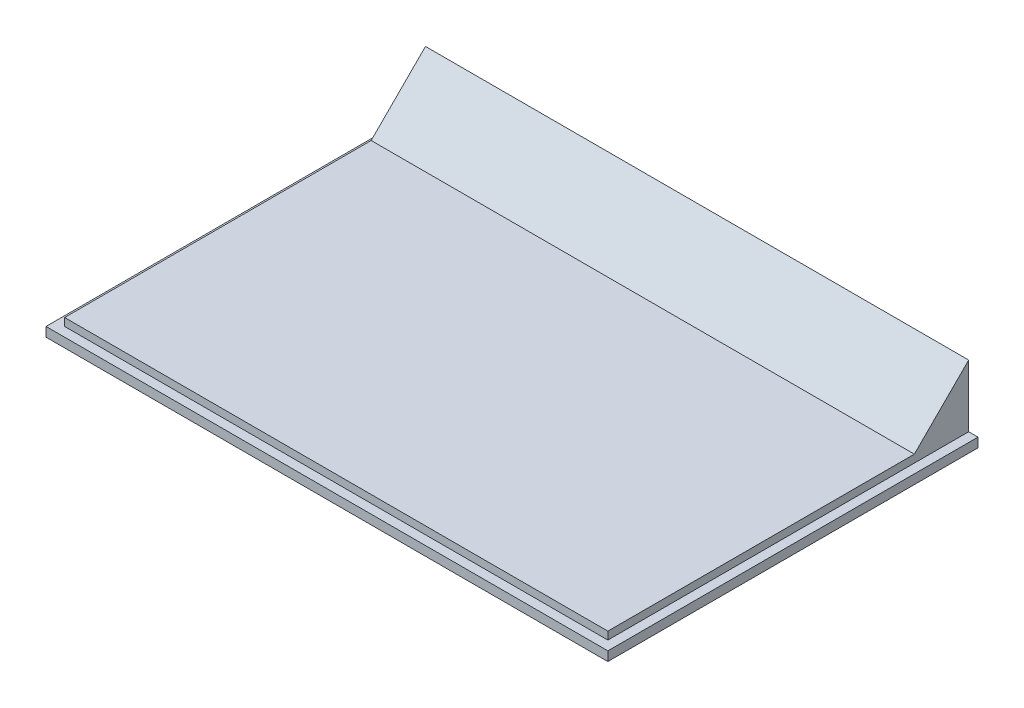
ISO-10303-21;
HEADER;
FILE_DESCRIPTION(('STEP AP214'),'2;1');
FILE_NAME('part.step','',(''),(''),'','','');
FILE_SCHEMA(('AUTOMOTIVE_DESIGN { 1 0 10303 214 1 1 1 1 }'));
ENDSEC;
DATA;
#1=APPLICATION_CONTEXT('core data for automotive mechanical design processes');
#2=APPLICATION_PROTOCOL_DEFINITION('international standard','automotive_design',2000,#1);
#3=PRODUCT_CONTEXT('',#1,'mechanical');
#4=PRODUCT('Part','Part','',(#3));
#5=PRODUCT_RELATED_PRODUCT_CATEGORY('part','',(#4));
#6=PRODUCT_DEFINITION_FORMATION('','',#4);
#7=PRODUCT_DEFINITION_CONTEXT('part definition',#1,'design');
#8=PRODUCT_DEFINITION('design','',#6,#7);
#9=PRODUCT_DEFINITION_SHAPE('','',#8);
#10=(LENGTH_UNIT() NAMED_UNIT(*) SI_UNIT(.MILLI.,.METRE.));
#11=(NAMED_UNIT(*) PLANE_ANGLE_UNIT() SI_UNIT($,.RADIAN.));
#12=(NAMED_UNIT(*) SI_UNIT($,.STERADIAN.) SOLID_ANGLE_UNIT());
#13=UNCERTAINTY_MEASURE_WITH_UNIT(LENGTH_MEASURE(1.E-05),#10,'distance_accuracy_value','');
#14=(GEOMETRIC_REPRESENTATION_CONTEXT(3) GLOBAL_UNCERTAINTY_ASSIGNED_CONTEXT((#13)) GLOBAL_UNIT_ASSIGNED_CONTEXT((#10,
#11,#12)) REPRESENTATION_CONTEXT('',''));
#15=CARTESIAN_POINT('',(0.,0.,0.));
#16=DIRECTION('',(0.,0.,1.));
#17=DIRECTION('',(1.,0.,0.));
#18=AXIS2_PLACEMENT_3D('',#15,#16,#17);
#19=CARTESIAN_POINT('',(0.,1.2,0.));
#20=DIRECTION('',(0.,-1.,0.));
#21=DIRECTION('',(0.,0.,-1.));
#22=AXIS2_PLACEMENT_3D('',#19,#20,#21);
#23=PLANE('',#22);
#24=DIRECTION('',(0.,0.,1.));
#25=VECTOR('',#24,1.);
#26=CARTESIAN_POINT('',(1.20000000000001,1.2,-47.7));
#27=LINE('',#26,#25);
#28=CARTESIAN_POINT('',(1.20000000000001,1.2,-47.7));
#29=VERTEX_POINT('',#28);
#30=CARTESIAN_POINT('',(1.20000000000001,1.2,-1.20000000000001));
#31=VERTEX_POINT('',#30);
#32=EDGE_CURVE('E138',#29,#31,#27,.T.);
#33=ORIENTED_EDGE('',*,*,#32,.F.);
#34=DIRECTION('',(-1.,0.,0.));
#35=VECTOR('',#34,1.);
#36=CARTESIAN_POINT('',(0.,1.2,-47.7));
#37=LINE('',#36,#35);
#38=CARTESIAN_POINT('',(0.,1.2,-47.7));
#39=VERTEX_POINT('',#38);
#40=EDGE_CURVE('E178',#29,#39,#37,.T.);
#41=ORIENTED_EDGE('',*,*,#40,.T.);
#42=DIRECTION('',(0.,0.,1.));
#43=VECTOR('',#42,1.);
#44=CARTESIAN_POINT('',(0.,1.2,0.));
#45=LINE('',#44,#43);
#46=CARTESIAN_POINT('',(0.,1.2,0.));
#47=VERTEX_POINT('',#46);
#48=EDGE_CURVE('E167',#39,#47,#45,.T.);
#49=ORIENTED_EDGE('',*,*,#48,.T.);
#50=DIRECTION('',(1.,0.,0.));
#51=VECTOR('',#50,1.);
#52=CARTESIAN_POINT('',(0.,1.2,0.));
#53=LINE('',#52,#51);
#54=CARTESIAN_POINT('',(72.4,1.2,0.));
#55=VERTEX_POINT('',#54);
#56=EDGE_CURVE('E171',#47,#55,#53,.T.);
#57=ORIENTED_EDGE('',*,*,#56,.T.);
#58=DIRECTION('',(0.,0.,-1.));
#59=VECTOR('',#58,1.);
#60=CARTESIAN_POINT('',(72.4,1.2,0.));
#61=LINE('',#60,#59);
#62=CARTESIAN_POINT('',(72.4,1.2,-47.7));
#63=VERTEX_POINT('',#62);
#64=EDGE_CURVE('E175',#55,#63,#61,.T.);
#65=ORIENTED_EDGE('',*,*,#64,.T.);
#66=CARTESIAN_POINT('',(71.2,1.2,-47.7));
#67=VERTEX_POINT('',#66);
#68=EDGE_CURVE('E179',#63,#67,#37,.T.);
#69=ORIENTED_EDGE('',*,*,#68,.T.);
#70=DIRECTION('',(0.,0.,-1.));
#71=VECTOR('',#70,1.);
#72=CARTESIAN_POINT('',(71.2,1.2,-47.7));
#73=LINE('',#72,#71);
#74=CARTESIAN_POINT('',(71.2,1.2,-1.20000000000001));
#75=VERTEX_POINT('',#74);
#76=EDGE_CURVE('E126',#75,#67,#73,.T.);
#77=ORIENTED_EDGE('',*,*,#76,.F.);
#78=DIRECTION('',(1.,0.,0.));
#79=VECTOR('',#78,1.);
#80=CARTESIAN_POINT('',(1.20000000000001,1.2,-1.20000000000001));
#81=LINE('',#80,#79);
#82=EDGE_CURVE('E66',#31,#75,#81,.T.);
#83=ORIENTED_EDGE('',*,*,#82,.F.);
#84=EDGE_LOOP('',(#33,#41,#49,#57,#65,#69,#77,#83));
#85=FACE_BOUND('',#84,.T.);
#86=ADVANCED_FACE('F41',(#85),#23,.F.);
#87=CARTESIAN_POINT('',(0.,1.2,0.));
#88=DIRECTION('',(1.,0.,0.));
#89=DIRECTION('',(0.,0.,-1.));
#90=AXIS2_PLACEMENT_3D('',#87,#88,#89);
#91=PLANE('',#90);
#92=DIRECTION('',(0.,0.,1.));
#93=VECTOR('',#92,1.);
#94=CARTESIAN_POINT('',(0.,0.,0.));
#95=LINE('',#94,#93);
#96=CARTESIAN_POINT('',(0.,0.,-47.7));
#97=VERTEX_POINT('',#96);
#98=CARTESIAN_POINT('',(0.,0.,0.));
#99=VERTEX_POINT('',#98);
#100=EDGE_CURVE('E166',#97,#99,#95,.T.);
#101=ORIENTED_EDGE('',*,*,#100,.T.);
#102=DIRECTION('',(0.,-1.,0.));
#103=VECTOR('',#102,1.);
#104=CARTESIAN_POINT('',(0.,1.2,0.));
#105=LINE('',#104,#103);
#106=EDGE_CURVE('E120',#47,#99,#105,.T.);
#107=ORIENTED_EDGE('',*,*,#106,.F.);
#108=ORIENTED_EDGE('',*,*,#48,.F.);
#109=DIRECTION('',(0.,-1.,0.));
#110=VECTOR('',#109,1.);
#111=CARTESIAN_POINT('',(0.,1.2,-47.7));
#112=LINE('',#111,#110);
#113=EDGE_CURVE('E182',#39,#97,#112,.T.);
#114=ORIENTED_EDGE('',*,*,#113,.T.);
#115=EDGE_LOOP('',(#101,#107,#108,#114));
#116=FACE_BOUND('',#115,.T.);
#117=ADVANCED_FACE('F214',(#116),#91,.F.);
#118=CARTESIAN_POINT('',(0.,1.2,0.));
#119=DIRECTION('',(0.,0.,-1.));
#120=DIRECTION('',(-1.,0.,0.));
#121=AXIS2_PLACEMENT_3D('',#118,#119,#120);
#122=PLANE('',#121);
#123=DIRECTION('',(1.,0.,0.));
#124=VECTOR('',#123,1.);
#125=CARTESIAN_POINT('',(0.,0.,0.));
#126=LINE('',#125,#124);
#127=CARTESIAN_POINT('',(72.4,0.,0.));
#128=VERTEX_POINT('',#127);
#129=EDGE_CURVE('E186',#99,#128,#126,.T.);
#130=ORIENTED_EDGE('',*,*,#129,.T.);
#131=DIRECTION('',(0.,-1.,0.));
#132=VECTOR('',#131,1.);
#133=CARTESIAN_POINT('',(72.4,1.2,0.));
#134=LINE('',#133,#132);
#135=EDGE_CURVE('E201',#55,#128,#134,.T.);
#136=ORIENTED_EDGE('',*,*,#135,.F.);
#137=ORIENTED_EDGE('',*,*,#56,.F.);
#138=ORIENTED_EDGE('',*,*,#106,.T.);
#139=EDGE_LOOP('',(#130,#136,#137,#138));
#140=FACE_BOUND('',#139,.T.);
#141=ADVANCED_FACE('F209',(#140),#122,.F.);
#142=CARTESIAN_POINT('',(72.4,1.2,0.));
#143=DIRECTION('',(-1.,0.,0.));
#144=DIRECTION('',(0.,0.,1.));
#145=AXIS2_PLACEMENT_3D('',#142,#143,#144);
#146=PLANE('',#145);
#147=DIRECTION('',(0.,0.,-1.));
#148=VECTOR('',#147,1.);
#149=CARTESIAN_POINT('',(72.4,0.,0.));
#150=LINE('',#149,#148);
#151=CARTESIAN_POINT('',(72.4,0.,-47.7));
#152=VERTEX_POINT('',#151);
#153=EDGE_CURVE('E189',#128,#152,#150,.T.);
#154=ORIENTED_EDGE('',*,*,#153,.T.);
#155=DIRECTION('',(0.,-1.,0.));
#156=VECTOR('',#155,1.);
#157=CARTESIAN_POINT('',(72.4,1.2,-47.7));
#158=LINE('',#157,#156);
#159=EDGE_CURVE('E197',#63,#152,#158,.T.);
#160=ORIENTED_EDGE('',*,*,#159,.F.);
#161=ORIENTED_EDGE('',*,*,#64,.F.);
#162=ORIENTED_EDGE('',*,*,#135,.T.);
#163=EDGE_LOOP('',(#154,#160,#161,#162));
#164=FACE_BOUND('',#163,.T.);
#165=ADVANCED_FACE('F222',(#164),#146,.F.);
#166=CARTESIAN_POINT('',(0.,1.2,-47.7));
#167=DIRECTION('',(0.,0.,1.));
#168=DIRECTION('',(1.,0.,0.));
#169=AXIS2_PLACEMENT_3D('',#166,#167,#168);
#170=PLANE('',#169);
#171=DIRECTION('',(-1.,0.,0.));
#172=VECTOR('',#171,1.);
#173=CARTESIAN_POINT('',(0.,0.,-47.7));
#174=LINE('',#173,#172);
#175=EDGE_CURVE('E172',#152,#97,#174,.T.);
#176=ORIENTED_EDGE('',*,*,#175,.T.);
#177=ORIENTED_EDGE('',*,*,#113,.F.);
#178=ORIENTED_EDGE('',*,*,#40,.F.);
#179=DIRECTION('',(0.,-1.,0.));
#180=VECTOR('',#179,1.);
#181=CARTESIAN_POINT('',(1.20000000000001,2.2,-47.7));
#182=LINE('',#181,#180);
#183=CARTESIAN_POINT('',(1.20000000000001,9.2,-47.7));
#184=VERTEX_POINT('',#183);
#185=EDGE_CURVE('E131',#184,#29,#182,.T.);
#186=ORIENTED_EDGE('',*,*,#185,.F.);
#187=DIRECTION('',(-1.,0.,0.));
#188=VECTOR('',#187,1.);
#189=CARTESIAN_POINT('',(71.2,9.2,-47.7));
#190=LINE('',#189,#188);
#191=CARTESIAN_POINT('',(71.2,9.2,-47.7));
#192=VERTEX_POINT('',#191);
#193=EDGE_CURVE('E116',#192,#184,#190,.T.);
#194=ORIENTED_EDGE('',*,*,#193,.F.);
#195=DIRECTION('',(0.,-1.,0.));
#196=VECTOR('',#195,1.);
#197=CARTESIAN_POINT('',(71.2,2.2,-47.7));
#198=LINE('',#197,#196);
#199=EDGE_CURVE('E123',#192,#67,#198,.T.);
#200=ORIENTED_EDGE('',*,*,#199,.T.);
#201=ORIENTED_EDGE('',*,*,#68,.F.);
#202=ORIENTED_EDGE('',*,*,#159,.T.);
#203=EDGE_LOOP('',(#176,#177,#178,#186,#194,#200,#201,#202));
#204=FACE_BOUND('',#203,.T.);
#205=ADVANCED_FACE('F134',(#204),#170,.F.);
#206=CARTESIAN_POINT('',(0.,0.,0.));
#207=DIRECTION('',(0.,-1.,0.));
#208=DIRECTION('',(0.,0.,-1.));
#209=AXIS2_PLACEMENT_3D('',#206,#207,#208);
#210=PLANE('',#209);
#211=ORIENTED_EDGE('',*,*,#100,.F.);
#212=ORIENTED_EDGE('',*,*,#175,.F.);
#213=ORIENTED_EDGE('',*,*,#153,.F.);
#214=ORIENTED_EDGE('',*,*,#129,.F.);
#215=EDGE_LOOP('',(#211,#212,#213,#214));
#216=FACE_BOUND('',#215,.T.);
#217=ADVANCED_FACE('F218',(#216),#210,.T.);
#218=CARTESIAN_POINT('',(1.20000000000001,2.2,-47.7));
#219=DIRECTION('',(1.,0.,0.));
#220=DIRECTION('',(0.,0.,-1.));
#221=AXIS2_PLACEMENT_3D('',#218,#219,#220);
#222=PLANE('',#221);
#223=DIRECTION('',(0.,0.,1.));
#224=VECTOR('',#223,1.);
#225=CARTESIAN_POINT('',(1.20000000000001,2.2,-47.7));
#226=LINE('',#225,#224);
#227=CARTESIAN_POINT('',(1.20000000000001,2.2,-40.7));
#228=VERTEX_POINT('',#227);
#229=CARTESIAN_POINT('',(1.20000000000001,2.2,-1.20000000000001));
#230=VERTEX_POINT('',#229);
#231=EDGE_CURVE('E146',#228,#230,#226,.T.);
#232=ORIENTED_EDGE('',*,*,#231,.F.);
#233=DIRECTION('',(0.,-0.70710678118655,0.707106781186545));
#234=VECTOR('',#233,1.);
#235=CARTESIAN_POINT('',(1.20000000000001,9.2,-47.7));
#236=LINE('',#235,#234);
#237=EDGE_CURVE('E11',#228,#184,#236,.F.);
#238=ORIENTED_EDGE('',*,*,#237,.T.);
#239=ORIENTED_EDGE('',*,*,#185,.T.);
#240=ORIENTED_EDGE('',*,*,#32,.T.);
#241=DIRECTION('',(0.,-1.,0.));
#242=VECTOR('',#241,1.);
#243=CARTESIAN_POINT('',(1.20000000000001,2.2,-1.20000000000001));
#244=LINE('',#243,#242);
#245=EDGE_CURVE('E163',#230,#31,#244,.T.);
#246=ORIENTED_EDGE('',*,*,#245,.F.);
#247=EDGE_LOOP('',(#232,#238,#239,#240,#246));
#248=FACE_BOUND('',#247,.T.);
#249=ADVANCED_FACE('F226',(#248),#222,.F.);
#250=CARTESIAN_POINT('',(1.20000000000001,2.2,-1.20000000000001));
#251=DIRECTION('',(0.,0.,-1.));
#252=DIRECTION('',(-1.,0.,0.));
#253=AXIS2_PLACEMENT_3D('',#250,#251,#252);
#254=PLANE('',#253);
#255=ORIENTED_EDGE('',*,*,#82,.T.);
#256=DIRECTION('',(0.,-1.,0.));
#257=VECTOR('',#256,1.);
#258=CARTESIAN_POINT('',(71.2,2.2,-1.20000000000001));
#259=LINE('',#258,#257);
#260=CARTESIAN_POINT('',(71.2,2.2,-1.20000000000001));
#261=VERTEX_POINT('',#260);
#262=EDGE_CURVE('E130',#261,#75,#259,.T.);
#263=ORIENTED_EDGE('',*,*,#262,.F.);
#264=DIRECTION('',(1.,0.,0.));
#265=VECTOR('',#264,1.);
#266=CARTESIAN_POINT('',(1.20000000000001,2.2,-1.20000000000001));
#267=LINE('',#266,#265);
#268=EDGE_CURVE('E149',#230,#261,#267,.T.);
#269=ORIENTED_EDGE('',*,*,#268,.F.);
#270=ORIENTED_EDGE('',*,*,#245,.T.);
#271=EDGE_LOOP('',(#255,#263,#269,#270));
#272=FACE_BOUND('',#271,.T.);
#273=ADVANCED_FACE('F232',(#272),#254,.F.);
#274=CARTESIAN_POINT('',(71.2,2.2,-47.7));
#275=DIRECTION('',(-1.,0.,0.));
#276=DIRECTION('',(0.,0.,1.));
#277=AXIS2_PLACEMENT_3D('',#274,#275,#276);
#278=PLANE('',#277);
#279=ORIENTED_EDGE('',*,*,#199,.F.);
#280=DIRECTION('',(0.,0.70710678118655,-0.707106781186545));
#281=VECTOR('',#280,1.);
#282=CARTESIAN_POINT('',(71.2,9.2,-47.7));
#283=LINE('',#282,#281);
#284=CARTESIAN_POINT('',(71.2,2.2,-40.7));
#285=VERTEX_POINT('',#284);
#286=EDGE_CURVE('E51',#192,#285,#283,.F.);
#287=ORIENTED_EDGE('',*,*,#286,.T.);
#288=DIRECTION('',(0.,0.,-1.));
#289=VECTOR('',#288,1.);
#290=CARTESIAN_POINT('',(71.2,2.2,-47.7));
#291=LINE('',#290,#289);
#292=EDGE_CURVE('E152',#261,#285,#291,.T.);
#293=ORIENTED_EDGE('',*,*,#292,.F.);
#294=ORIENTED_EDGE('',*,*,#262,.T.);
#295=ORIENTED_EDGE('',*,*,#76,.T.);
#296=EDGE_LOOP('',(#279,#287,#293,#294,#295));
#297=FACE_BOUND('',#296,.T.);
#298=ADVANCED_FACE('F124',(#297),#278,.F.);
#299=CARTESIAN_POINT('',(0.,2.2,0.));
#300=DIRECTION('',(0.,1.,0.));
#301=DIRECTION('',(0.,0.,1.));
#302=AXIS2_PLACEMENT_3D('',#299,#300,#301);
#303=PLANE('',#302);
#304=DIRECTION('',(1.,0.,0.));
#305=VECTOR('',#304,1.);
#306=CARTESIAN_POINT('',(71.2,2.2,-40.7));
#307=LINE('',#306,#305);
#308=EDGE_CURVE('E58',#228,#285,#307,.T.);
#309=ORIENTED_EDGE('',*,*,#308,.F.);
#310=ORIENTED_EDGE('',*,*,#231,.T.);
#311=ORIENTED_EDGE('',*,*,#268,.T.);
#312=ORIENTED_EDGE('',*,*,#292,.T.);
#313=EDGE_LOOP('',(#309,#310,#311,#312));
#314=FACE_BOUND('',#313,.T.);
#315=ADVANCED_FACE('F229',(#314),#303,.T.);
#316=CARTESIAN_POINT('',(0.,9.2,-47.7));
#317=DIRECTION('',(0.,-0.707106781186545,-0.70710678118655));
#318=DIRECTION('',(1.,0.,0.));
#319=AXIS2_PLACEMENT_3D('',#316,#317,#318);
#320=PLANE('',#319);
#321=ORIENTED_EDGE('',*,*,#237,.F.);
#322=ORIENTED_EDGE('',*,*,#308,.T.);
#323=ORIENTED_EDGE('',*,*,#286,.F.);
#324=ORIENTED_EDGE('',*,*,#193,.T.);
#325=EDGE_LOOP('',(#321,#322,#323,#324));
#326=FACE_BOUND('',#325,.T.);
#327=ADVANCED_FACE('F44',(#326),#320,.F.);
#328=CLOSED_SHELL('',(#86,#117,#141,#165,#205,#217,#249,#273,#298,#315,#327));
#329=MANIFOLD_SOLID_BREP('B2',#328);
#330=ADVANCED_BREP_SHAPE_REPRESENTATION('',(#18,#329),#14);
#331=SHAPE_DEFINITION_REPRESENTATION(#9,#330);
ENDSEC;
END-ISO-10303-21;
